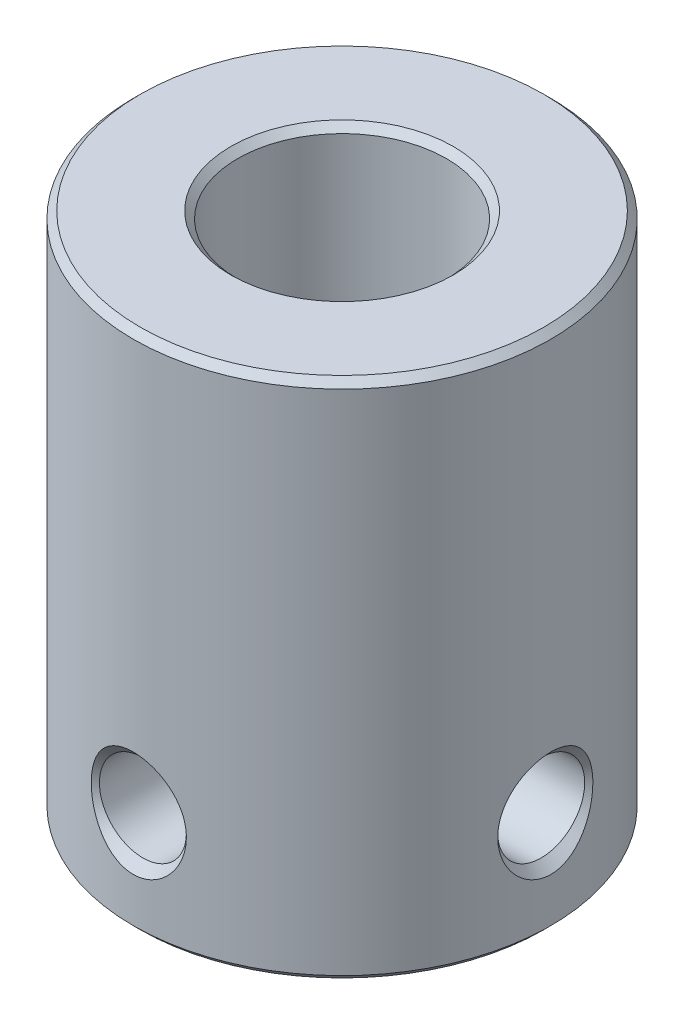
ISO-10303-21;
HEADER;
FILE_DESCRIPTION(('STEP AP214'),'2;1');
FILE_NAME('part.step','',(''),(''),'','','');
FILE_SCHEMA(('AUTOMOTIVE_DESIGN { 1 0 10303 214 1 1 1 1 }'));
ENDSEC;
DATA;
#1=APPLICATION_CONTEXT('core data for automotive mechanical design processes');
#2=APPLICATION_PROTOCOL_DEFINITION('international standard','automotive_design',2000,#1);
#3=PRODUCT_CONTEXT('',#1,'mechanical');
#4=PRODUCT('Part','Part','',(#3));
#5=PRODUCT_RELATED_PRODUCT_CATEGORY('part','',(#4));
#6=PRODUCT_DEFINITION_FORMATION('','',#4);
#7=PRODUCT_DEFINITION_CONTEXT('part definition',#1,'design');
#8=PRODUCT_DEFINITION('design','',#6,#7);
#9=PRODUCT_DEFINITION_SHAPE('','',#8);
#10=(LENGTH_UNIT() NAMED_UNIT(*) SI_UNIT(.MILLI.,.METRE.));
#11=(NAMED_UNIT(*) PLANE_ANGLE_UNIT() SI_UNIT($,.RADIAN.));
#12=(NAMED_UNIT(*) SI_UNIT($,.STERADIAN.) SOLID_ANGLE_UNIT());
#13=UNCERTAINTY_MEASURE_WITH_UNIT(LENGTH_MEASURE(1.E-05),#10,'distance_accuracy_value','');
#14=(GEOMETRIC_REPRESENTATION_CONTEXT(3) GLOBAL_UNCERTAINTY_ASSIGNED_CONTEXT((#13)) GLOBAL_UNIT_ASSIGNED_CONTEXT((#10,
#11,#12)) REPRESENTATION_CONTEXT('',''));
#15=CARTESIAN_POINT('',(0.,0.,0.));
#16=DIRECTION('',(0.,0.,1.));
#17=DIRECTION('',(1.,0.,0.));
#18=AXIS2_PLACEMENT_3D('',#15,#16,#17);
#19=CARTESIAN_POINT('',(0.,7.5,0.));
#20=DIRECTION('',(0.,1.,0.));
#21=DIRECTION('',(0.,0.,1.));
#22=AXIS2_PLACEMENT_3D('',#19,#20,#21);
#23=PLANE('',#22);
#24=CARTESIAN_POINT('',(0.,7.5,0.));
#25=DIRECTION('',(0.,1.,0.));
#26=DIRECTION('',(0.,0.,1.));
#27=AXIS2_PLACEMENT_3D('',#24,#25,#26);
#28=CIRCLE('',#27,3.2);
#29=CARTESIAN_POINT('',(0.,7.5,3.2));
#30=VERTEX_POINT('',#29);
#31=EDGE_CURVE('E39',#30,#30,#28,.F.);
#32=ORIENTED_EDGE('',*,*,#31,.T.);
#33=EDGE_LOOP('',(#32));
#34=FACE_BOUND('',#33,.T.);
#35=CARTESIAN_POINT('',(0.,7.5,0.));
#36=DIRECTION('',(0.,1.,0.));
#37=DIRECTION('',(0.,0.,1.));
#38=AXIS2_PLACEMENT_3D('',#35,#36,#37);
#39=CIRCLE('',#38,5.8);
#40=CARTESIAN_POINT('',(0.,7.5,5.8));
#41=VERTEX_POINT('',#40);
#42=EDGE_CURVE('E61',#41,#41,#39,.T.);
#43=ORIENTED_EDGE('',*,*,#42,.T.);
#44=EDGE_LOOP('',(#43));
#45=FACE_BOUND('',#44,.T.);
#46=ADVANCED_FACE('F32',(#34,#45),#23,.T.);
#47=CARTESIAN_POINT('',(0.,-7.5,0.));
#48=DIRECTION('',(0.,1.,0.));
#49=DIRECTION('',(0.,0.,1.));
#50=AXIS2_PLACEMENT_3D('',#47,#48,#49);
#51=PLANE('',#50);
#52=CARTESIAN_POINT('',(0.,-7.5,0.));
#53=DIRECTION('',(0.,1.,0.));
#54=DIRECTION('',(0.,0.,1.));
#55=AXIS2_PLACEMENT_3D('',#52,#53,#54);
#56=CIRCLE('',#55,3.2);
#57=CARTESIAN_POINT('',(0.,-7.5,3.2));
#58=VERTEX_POINT('',#57);
#59=EDGE_CURVE('E10',#58,#58,#56,.T.);
#60=ORIENTED_EDGE('',*,*,#59,.T.);
#61=EDGE_LOOP('',(#60));
#62=FACE_BOUND('',#61,.T.);
#63=CARTESIAN_POINT('',(0.,-7.5,0.));
#64=DIRECTION('',(0.,1.,0.));
#65=DIRECTION('',(0.,0.,1.));
#66=AXIS2_PLACEMENT_3D('',#63,#64,#65);
#67=CIRCLE('',#66,5.8);
#68=CARTESIAN_POINT('',(0.,-7.5,5.8));
#69=VERTEX_POINT('',#68);
#70=EDGE_CURVE('E52',#69,#69,#67,.F.);
#71=ORIENTED_EDGE('',*,*,#70,.T.);
#72=EDGE_LOOP('',(#71));
#73=FACE_BOUND('',#72,.T.);
#74=ADVANCED_FACE('F130',(#62,#73),#51,.F.);
#75=CARTESIAN_POINT('',(0.,7.5,0.));
#76=DIRECTION('',(0.,-1.,0.));
#77=DIRECTION('',(0.,0.,-1.));
#78=AXIS2_PLACEMENT_3D('',#75,#76,#77);
#79=CYLINDRICAL_SURFACE('',#78,6.);
#80=CARTESIAN_POINT('',(0.,7.3,0.));
#81=DIRECTION('',(0.,1.,0.));
#82=DIRECTION('',(0.,0.,1.));
#83=AXIS2_PLACEMENT_3D('',#80,#81,#82);
#84=CIRCLE('',#83,6.);
#85=CARTESIAN_POINT('',(0.,7.3,6.));
#86=VERTEX_POINT('',#85);
#87=EDGE_CURVE('E55',#86,#86,#84,.F.);
#88=ORIENTED_EDGE('',*,*,#87,.T.);
#89=EDGE_LOOP('',(#88));
#90=FACE_BOUND('',#89,.T.);
#91=CARTESIAN_POINT('',(0.,-7.3,0.));
#92=DIRECTION('',(0.,1.,0.));
#93=DIRECTION('',(0.,0.,1.));
#94=AXIS2_PLACEMENT_3D('',#91,#92,#93);
#95=CIRCLE('',#94,6.);
#96=CARTESIAN_POINT('',(0.,-7.3,6.));
#97=VERTEX_POINT('',#96);
#98=EDGE_CURVE('E58',#97,#97,#95,.T.);
#99=ORIENTED_EDGE('',*,*,#98,.T.);
#100=EDGE_LOOP('',(#99));
#101=FACE_BOUND('',#100,.T.);
#102=CARTESIAN_POINT('',(5.91483775658698,-5.52880434718538,-1.00732038769464));
#103=CARTESIAN_POINT('',(5.92250143302276,-5.58359558251655,-0.96231719133285));
#104=CARTESIAN_POINT('',(5.93030364918487,-5.63514907366489,-0.913408766582243));
#105=CARTESIAN_POINT('',(5.94553080189818,-5.73042720717013,-0.808379865747829));
#106=CARTESIAN_POINT('',(5.95295567860448,-5.77415061045651,-0.752258250623685));
#107=CARTESIAN_POINT('',(5.96766017069519,-5.85751577321552,-0.625775906560477));
#108=CARTESIAN_POINT('',(5.97478837095161,-5.89583564457271,-0.554514363546628));
#109=CARTESIAN_POINT('',(5.98671934201503,-5.95843229055529,-0.405867471684212));
#110=CARTESIAN_POINT('',(5.99152330296312,-5.98271625359679,-0.328485280620282));
#111=CARTESIAN_POINT('',(5.99774309929264,-6.01389061790406,-0.179022980119083));
#112=CARTESIAN_POINT('',(5.99947254754072,-6.02239554861059,-0.107291191193534));
#113=CARTESIAN_POINT('',(6.00031889859756,-6.02657519783022,0.0365433461045991));
#114=CARTESIAN_POINT('',(5.99943704967178,-6.0222560465731,0.108645900791913));
#115=CARTESIAN_POINT('',(5.9953141428284,-6.00174251937129,0.246267331412398));
#116=CARTESIAN_POINT('',(5.99222926587409,-5.98633378990009,0.311910511379788));
#117=CARTESIAN_POINT('',(5.98420472660848,-5.94526541286433,0.439773481718744));
#118=CARTESIAN_POINT('',(5.97926484940367,-5.91960457761698,0.501992874501983));
#119=CARTESIAN_POINT('',(5.96780788972078,-5.85798302314558,0.623821573841086));
#120=CARTESIAN_POINT('',(5.96123965290115,-5.82167938446308,0.683251734031637));
#121=CARTESIAN_POINT('',(5.94725631626724,-5.74054126278918,0.795843853683658));
#122=CARTESIAN_POINT('',(5.93984090319929,-5.69570362013862,0.849003479675818));
#123=CARTESIAN_POINT('',(5.92402343783295,-5.59381714213767,0.953425641188953));
#124=CARTESIAN_POINT('',(5.91559884905014,-5.53598399195474,1.0039189675661));
#125=CARTESIAN_POINT('',(5.89930740201001,-5.41329729865581,1.09560247377607));
#126=CARTESIAN_POINT('',(5.89144079995428,-5.34844056472943,1.13678839881262));
#127=CARTESIAN_POINT('',(5.87619471710081,-5.20602554544595,1.21326939045289));
#128=CARTESIAN_POINT('',(5.86895929187496,-5.12785179755007,1.24744994572646));
#129=CARTESIAN_POINT('',(5.85681342349581,-4.96698149587859,1.30328607153369));
#130=CARTESIAN_POINT('',(5.85190368791816,-4.88428357417848,1.32493783070759));
#131=CARTESIAN_POINT('',(5.84470479401133,-4.71114418639205,1.35635884916716));
#132=CARTESIAN_POINT('',(5.84259984288051,-4.62054279552529,1.36529527069334));
#133=CARTESIAN_POINT('',(5.84184891201592,-4.43906164612307,1.36850379007076));
#134=CARTESIAN_POINT('',(5.84320343033836,-4.34818184938716,1.36277377641035));
#135=CARTESIAN_POINT('',(5.84926447121163,-4.167114005683,1.33652139344611));
#136=CARTESIAN_POINT('',(5.85402734914448,-4.07696371182694,1.31575025758392));
#137=CARTESIAN_POINT('',(5.86639064678413,-3.90155996932685,1.25947827652881));
#138=CARTESIAN_POINT('',(5.87399147604598,-3.81630722951656,1.22397530524896));
#139=CARTESIAN_POINT('',(5.89099266428588,-3.65431766227651,1.13931658553145));
#140=CARTESIAN_POINT('',(5.90037103529285,-3.57749322211883,1.09032465076896));
#141=CARTESIAN_POINT('',(5.91980290525049,-3.43393683171995,0.979334263350389));
#142=CARTESIAN_POINT('',(5.92985625339069,-3.36720263777469,0.917338709567679));
#143=CARTESIAN_POINT('',(5.94866235503463,-3.25047970796999,0.785839093358964));
#144=CARTESIAN_POINT('',(5.95745709429637,-3.19971020945739,0.717037204024117));
#145=CARTESIAN_POINT('',(5.97323304290606,-3.11218993947923,0.570842030480323));
#146=CARTESIAN_POINT('',(5.98021625620802,-3.07542365604582,0.493458376126511));
#147=CARTESIAN_POINT('',(5.99065652467354,-3.02156453936078,0.342181655398979));
#148=CARTESIAN_POINT('',(5.99443248305544,-3.00266187515818,0.268954589457799));
#149=CARTESIAN_POINT('',(5.99925587966176,-2.97862989467197,0.120197675343194));
#150=CARTESIAN_POINT('',(6.0003052608659,-2.97349077030445,0.0446695058064256));
#151=CARTESIAN_POINT('',(5.99957496988739,-2.97710002520825,-0.0987424051799276));
#152=CARTESIAN_POINT('',(5.9980572860741,-2.98456222093989,-0.166663760494614));
#153=CARTESIAN_POINT('',(5.99285568280296,-3.01058412024266,-0.300247551750553));
#154=CARTESIAN_POINT('',(5.98917182574296,-3.02914350415323,-0.365910052701725));
#155=CARTESIAN_POINT('',(5.98002734531731,-3.07650122650132,-0.493317050061272));
#156=CARTESIAN_POINT('',(5.974565603009,-3.10530601412067,-0.555059049712904));
#157=CARTESIAN_POINT('',(5.96240111334889,-3.17198493978084,-0.673283580356394));
#158=CARTESIAN_POINT('',(5.95569801010474,-3.2098616796235,-0.729764596051797));
#159=CARTESIAN_POINT('',(5.94103703297596,-3.29703511182797,-0.841132455502549));
#160=CARTESIAN_POINT('',(5.93302078003899,-3.34703600676436,-0.895459311913344));
#161=CARTESIAN_POINT('',(5.91698216428724,-3.45464944395809,-0.995950274759308));
#162=CARTESIAN_POINT('',(5.90895980035552,-3.51226546103483,-1.0421106321565));
#163=CARTESIAN_POINT('',(5.89273640259105,-3.64050732728281,-1.13044343631093));
#164=CARTESIAN_POINT('',(5.88461868247891,-3.7118675568078,-1.17156643394772));
#165=CARTESIAN_POINT('',(5.87007047103072,-3.86019744984599,-1.24241014142088));
#166=CARTESIAN_POINT('',(5.86364060626173,-3.93716918295645,-1.27212661880632));
#167=CARTESIAN_POINT('',(5.85267221327211,-4.10131546169884,-1.32171593410431));
#168=CARTESIAN_POINT('',(5.84833204593824,-4.18880904970982,-1.34058159574163));
#169=CARTESIAN_POINT('',(5.84286977192732,-4.36578400660721,-1.36419197372845));
#170=CARTESIAN_POINT('',(5.84174832468513,-4.455265779039,-1.36893379646578));
#171=CARTESIAN_POINT('',(5.8428695828304,-4.63659285361932,-1.36414222217699));
#172=CARTESIAN_POINT('',(5.84521689344821,-4.72842613479394,-1.35416496629165));
#173=CARTESIAN_POINT('',(5.85318843834412,-4.90908399926716,-1.31928088071326));
#174=CARTESIAN_POINT('',(5.85881292892226,-4.99790834666961,-1.29437288331995));
#175=CARTESIAN_POINT('',(5.87221550271232,-5.16449188907803,-1.23208258805451));
#176=CARTESIAN_POINT('',(5.87983549061587,-5.24259564052972,-1.19558555115354));
#177=CARTESIAN_POINT('',(5.89651629692057,-5.39163991471806,-1.1103933282274));
#178=CARTESIAN_POINT('',(5.90557585236715,-5.46258662805586,-1.06170881311713));
#179=CARTESIAN_POINT('',(5.91483775658698,-5.52880434718538,-1.00732038769464));
#180=B_SPLINE_CURVE_WITH_KNOTS('',3,(#102,#103,#104,#105,#106,#107,#108,#109,#110,#111,#112,
#113,#114,#115,#116,#117,#118,#119,#120,#121,#122,#123,#124,#125,#126,#127,#128,#129,#130,#131,
#132,#133,#134,#135,#136,#137,#138,#139,#140,#141,#142,#143,#144,#145,#146,#147,#148,#149,#150,
#151,#152,#153,#154,#155,#156,#157,#158,#159,#160,#161,#162,#163,#164,#165,#166,#167,#168,#169,
#170,#171,#172,#173,#174,#175,#176,#177,#178,#179),.UNSPECIFIED.,.T.,.F.,(4,2,2,2,2,2,2,2,2,2,2,
2,2,2,2,2,2,2,2,2,2,2,2,2,2,2,2,2,2,2,2,2,2,2,2,2,2,2,4),(0.,0.213733155541429,
0.427500103408986,0.669774253726973,0.911924214426111,1.12753658726001,1.34304590861946,
1.54462496549482,1.74622738161344,1.95521605804028,2.16428226220785,2.39504187409212,
2.62590676325623,2.88167235444699,3.13751571072332,3.40944750266354,3.68141844654747,
3.95799338049485,4.2346082434101,4.50800168423482,4.78133424260522,5.03775015078952,
5.29388118407226,5.51978182408476,5.74552144137092,5.94958401217287,6.15364070512412,
6.35782607377605,6.56207007229319,6.78397194471273,7.00597542394403,7.25320961412632,
7.50053545341273,7.76814510772494,8.03580958461881,8.3117123175442,8.58763663102754,
8.84616851973653,9.10447483418194),.UNSPECIFIED.);
#181=CARTESIAN_POINT('',(5.91483775658698,-5.52880434718538,-1.00732038769464));
#182=VERTEX_POINT('',#181);
#183=EDGE_CURVE('E64',#182,#182,#180,.T.);
#184=ORIENTED_EDGE('',*,*,#183,.T.);
#185=EDGE_LOOP('',(#184));
#186=FACE_BOUND('',#185,.T.);
#187=CARTESIAN_POINT('',(-1.00732038769462,-5.52880434718538,5.91483775658699));
#188=CARTESIAN_POINT('',(-1.0625572167337,-5.46155091999607,5.90543128244687));
#189=CARTESIAN_POINT('',(-1.1119450928033,-5.38937330269842,5.89622727626031));
#190=CARTESIAN_POINT('',(-1.19816011091402,-5.23762009401937,5.87931576917396));
#191=CARTESIAN_POINT('',(-1.23496409543614,-5.15803120271254,5.87161103842038));
#192=CARTESIAN_POINT('',(-1.29550008714942,-4.99351722786288,5.85855311445987));
#193=CARTESIAN_POINT('',(-1.31918435597302,-4.908573893283,5.8532085231466));
#194=CARTESIAN_POINT('',(-1.35290234778387,-4.73593483174043,5.84550733148309));
#195=CARTESIAN_POINT('',(-1.36294121055757,-4.64824015386151,5.8431496060991));
#196=CARTESIAN_POINT('',(-1.3693652007367,-4.46853001119642,5.84164829843658));
#197=CARTESIAN_POINT('',(-1.36514396828115,-4.37649105273633,5.84264744553621));
#198=CARTESIAN_POINT('',(-1.34176422645992,-4.19440863279622,5.84806031937853));
#199=CARTESIAN_POINT('',(-1.32260179220375,-4.10436570204361,5.85247494332733));
#200=CARTESIAN_POINT('',(-1.26955658372633,-3.92854446132797,5.86421037888129));
#201=CARTESIAN_POINT('',(-1.23561954165774,-3.84278318511065,5.87154189574134));
#202=CARTESIAN_POINT('',(-1.15355452356077,-3.67851037144327,5.88821351349966));
#203=CARTESIAN_POINT('',(-1.10542559254557,-3.59999932233548,5.89755374955527));
#204=CARTESIAN_POINT('',(-0.997431067079705,-3.45518930712506,5.91675947634123));
#205=CARTESIAN_POINT('',(-0.937956064421904,-3.38859712422252,5.92660116071936));
#206=CARTESIAN_POINT('',(-0.8075727785725,-3.26760988936145,5.9457671407107));
#207=CARTESIAN_POINT('',(-0.736672119814303,-3.213206761018,5.9550917758162));
#208=CARTESIAN_POINT('',(-0.592229184508392,-3.12374817682862,5.97110086326186));
#209=CARTESIAN_POINT('',(-0.519522334296951,-3.08737781321554,5.97794883133935));
#210=CARTESIAN_POINT('',(-0.368354061775824,-3.02911448741262,5.98915923947937));
#211=CARTESIAN_POINT('',(-0.289899115696944,-3.00720550237337,5.99352442965381));
#212=CARTESIAN_POINT('',(-0.13979016106698,-2.98096768330364,5.99878383296519));
#213=CARTESIAN_POINT('',(-0.0684608162744463,-2.97483351117073,6.00003390907518));
#214=CARTESIAN_POINT('',(0.0741565668801916,-2.97517315802589,5.99996473941875));
#215=CARTESIAN_POINT('',(0.145444611044835,-2.98164269809429,5.99864636563278));
#216=CARTESIAN_POINT('',(0.281699711330631,-3.00609283682453,5.99374965828111));
#217=CARTESIAN_POINT('',(0.346795376060322,-3.0233957922328,5.99030452290537));
#218=CARTESIAN_POINT('',(0.473295716776517,-3.0680653954857,5.98163978874799));
#219=CARTESIAN_POINT('',(0.534699911497292,-3.09543335223238,5.97641995918308));
#220=CARTESIAN_POINT('',(0.65514893789217,-3.16056506272911,5.96444546834219));
#221=CARTESIAN_POINT('',(0.713964814463625,-3.1987396347208,5.95763252098112));
#222=CARTESIAN_POINT('',(0.82507501536845,-3.28349324999904,5.94326477324329));
#223=CARTESIAN_POINT('',(0.877366791748901,-3.33007555961427,5.93570968507338));
#224=CARTESIAN_POINT('',(0.979878874616083,-3.43562797531465,5.91969696852427));
#225=CARTESIAN_POINT('',(1.02928222856886,-3.49538963393331,5.91122908464167));
#226=CARTESIAN_POINT('',(1.11849706997978,-3.62176985100494,5.89499995296438));
#227=CARTESIAN_POINT('',(1.15830421538347,-3.68839149405212,5.88723902603517));
#228=CARTESIAN_POINT('',(1.23150221770142,-3.83414545659208,5.87238854278172));
#229=CARTESIAN_POINT('',(1.26377583596079,-3.91385642111225,5.86545576964514));
#230=CARTESIAN_POINT('',(1.31553900889379,-4.07749466440027,5.85406362893617));
#231=CARTESIAN_POINT('',(1.33502492532302,-4.16142313579053,5.84960496533133));
#232=CARTESIAN_POINT('',(1.36167438773833,-4.3363287095171,5.84346196331302));
#233=CARTESIAN_POINT('',(1.36805648423666,-4.42743207515459,5.84195380587374));
#234=CARTESIAN_POINT('',(1.36606722652635,-4.60947458279687,5.84241898623785));
#235=CARTESIAN_POINT('',(1.35769381176682,-4.70041370008975,5.84439281028674));
#236=CARTESIAN_POINT('',(1.3261106711044,-4.88087251754856,5.8516404284706));
#237=CARTESIAN_POINT('',(1.30269440448541,-4.97035439309859,5.85696014054536));
#238=CARTESIAN_POINT('',(1.24121316011803,-5.14395500428369,5.87029590269997));
#239=CARTESIAN_POINT('',(1.20314612768998,-5.22807298573593,5.87831233095778));
#240=CARTESIAN_POINT('',(1.1136494956924,-5.38708237219113,5.895916249366));
#241=CARTESIAN_POINT('',(1.06242403970803,-5.46209099188998,5.90547897651683));
#242=CARTESIAN_POINT('',(0.94722814343741,-5.60157482906759,5.92504502332219));
#243=CARTESIAN_POINT('',(0.883261528037212,-5.66605319717313,5.93504821005079));
#244=CARTESIAN_POINT('',(0.748703574776038,-5.77762814169033,5.95346362496181));
#245=CARTESIAN_POINT('',(0.678855355228888,-5.82560676043869,5.96193773582487));
#246=CARTESIAN_POINT('',(0.531105524715199,-5.90737381699441,5.9769062092819));
#247=CARTESIAN_POINT('',(0.453213174667967,-5.94117835087217,5.98340281521654));
#248=CARTESIAN_POINT('',(0.301742486861647,-5.98938877554947,5.99282925286203));
#249=CARTESIAN_POINT('',(0.228770506103551,-6.00563759021851,5.99609387934914));
#250=CARTESIAN_POINT('',(0.0810310347313774,-6.02456715573357,5.99990641356615));
#251=CARTESIAN_POINT('',(0.00626477786796726,-6.02725697559177,6.00045613716958));
#252=CARTESIAN_POINT('',(-0.135775253712959,-6.01930139765877,5.99884670170859));
#253=CARTESIAN_POINT('',(-0.203121027444959,-6.00982726074938,5.99692544307746));
#254=CARTESIAN_POINT('',(-0.335264748290144,-5.98000168075585,5.99099100463259));
#255=CARTESIAN_POINT('',(-0.400062186390657,-5.95964807630015,5.98697740914826));
#256=CARTESIAN_POINT('',(-0.526115404644998,-5.90873578458455,5.97722735475829));
#257=CARTESIAN_POINT('',(-0.58732833618892,-5.87807515895454,5.97147374623539));
#258=CARTESIAN_POINT('',(-0.704205646800115,-5.80783224011122,5.95882130341706));
#259=CARTESIAN_POINT('',(-0.759873062239022,-5.76825486829321,5.95192310140536));
#260=CARTESIAN_POINT('',(-0.847902845940638,-5.69544593662472,5.93989518893234));
#261=CARTESIAN_POINT('',(-0.882006576514371,-5.66426087416513,5.93490934552203));
#262=CARTESIAN_POINT('',(-0.94706242091887,-5.59878064313327,5.92487592256493));
#263=CARTESIAN_POINT('',(-0.978014589884656,-5.56448552898969,5.91982834409989));
#264=CARTESIAN_POINT('',(-1.00732038769462,-5.52880434718538,5.91483775658699));
#265=B_SPLINE_CURVE_WITH_KNOTS('',3,(#187,#188,#189,#190,#191,#192,#193,#194,#195,#196,#197,
#198,#199,#200,#201,#202,#203,#204,#205,#206,#207,#208,#209,#210,#211,#212,#213,#214,#215,#216,
#217,#218,#219,#220,#221,#222,#223,#224,#225,#226,#227,#228,#229,#230,#231,#232,#233,#234,#235,
#236,#237,#238,#239,#240,#241,#242,#243,#244,#245,#246,#247,#248,#249,#250,#251,#252,#253,#254,
#255,#256,#257,#258,#259,#260,#261,#262,#263,#264),.UNSPECIFIED.,.T.,.F.,(4,2,2,2,2,2,2,2,2,2,2,
2,2,2,2,2,2,2,2,2,2,2,2,2,2,2,2,2,2,2,2,2,2,2,2,2,2,2,4),(0.,0.262436347529811,
0.525353076759219,0.789220293463886,1.05298809229006,1.32811039544879,1.6033049945899,
1.87951903929044,2.15575167496151,2.42378855151126,2.69164729993872,2.93499491007315,
3.17807244246412,3.39175918356619,3.60537339135056,3.80680298500645,4.00825878282087,
4.21874018382817,4.42930353161712,4.66234338592004,4.89548848808495,5.15318720780322,
5.41095921394385,5.68370323030381,5.95648533734415,6.233095240581,6.50974395079713,
6.78233570784823,7.05484575606622,7.30888108663873,7.56262714858272,7.78588157210961,
8.00898665079045,8.21213588750413,8.41532549790893,8.62058689753883,8.82573528413765,
8.96497284079323,9.10420796113757),.UNSPECIFIED.);
#266=CARTESIAN_POINT('',(-1.00732038769462,-5.52880434718538,5.91483775658699));
#267=VERTEX_POINT('',#266);
#268=EDGE_CURVE('E72',#267,#267,#265,.T.);
#269=ORIENTED_EDGE('',*,*,#268,.T.);
#270=EDGE_LOOP('',(#269));
#271=FACE_BOUND('',#270,.T.);
#272=ADVANCED_FACE('F78',(#90,#101,#186,#271),#79,.T.);
#273=CARTESIAN_POINT('',(0.,7.5,0.));
#274=DIRECTION('',(0.,-1.,0.));
#275=DIRECTION('',(0.,0.,-1.));
#276=AXIS2_PLACEMENT_3D('',#273,#274,#275);
#277=CYLINDRICAL_SURFACE('',#276,3.);
#278=CARTESIAN_POINT('',(0.,7.3,0.));
#279=DIRECTION('',(0.,1.,0.));
#280=DIRECTION('',(0.,0.,1.));
#281=AXIS2_PLACEMENT_3D('',#278,#279,#280);
#282=CIRCLE('',#281,3.);
#283=CARTESIAN_POINT('',(0.,7.3,3.));
#284=VERTEX_POINT('',#283);
#285=EDGE_CURVE('E43',#284,#284,#282,.T.);
#286=ORIENTED_EDGE('',*,*,#285,.T.);
#287=EDGE_LOOP('',(#286));
#288=FACE_BOUND('',#287,.T.);
#289=CARTESIAN_POINT('',(0.,-7.3,0.));
#290=DIRECTION('',(0.,1.,0.));
#291=DIRECTION('',(0.,0.,1.));
#292=AXIS2_PLACEMENT_3D('',#289,#290,#291);
#293=CIRCLE('',#292,3.);
#294=CARTESIAN_POINT('',(0.,-7.3,3.));
#295=VERTEX_POINT('',#294);
#296=EDGE_CURVE('E47',#295,#295,#293,.F.);
#297=ORIENTED_EDGE('',*,*,#296,.T.);
#298=EDGE_LOOP('',(#297));
#299=FACE_BOUND('',#298,.T.);
#300=CARTESIAN_POINT('',(2.72717802865893,-4.5,-1.25000000000001));
#301=CARTESIAN_POINT('',(2.72718519563219,-4.56667189089685,-1.24999259066568));
#302=CARTESIAN_POINT('',(2.729658595344,-4.63345265682621,-1.24463203881504));
#303=CARTESIAN_POINT('',(2.73923833650884,-4.76508694205714,-1.22339678947785));
#304=CARTESIAN_POINT('',(2.74635725824266,-4.82993472667524,-1.20749354003277));
#305=CARTESIAN_POINT('',(2.76426917574767,-4.95556112969107,-1.16589988419452));
#306=CARTESIAN_POINT('',(2.77504717562615,-5.01635516371502,-1.14024937431429));
#307=CARTESIAN_POINT('',(2.79904148565793,-5.13275944957805,-1.08000637754464));
#308=CARTESIAN_POINT('',(2.81225721880783,-5.18837092343312,-1.04541600591532));
#309=CARTESIAN_POINT('',(2.84055762619856,-5.29632572497347,-0.965973882676176));
#310=CARTESIAN_POINT('',(2.85570568079145,-5.34830755874409,-0.920653238184418));
#311=CARTESIAN_POINT('',(2.88564295372226,-5.44420022249755,-0.82202167574556));
#312=CARTESIAN_POINT('',(2.90043203180789,-5.48810794061301,-0.768707691374015));
#313=CARTESIAN_POINT('',(2.92875537930613,-5.56844953087928,-0.652763393797359));
#314=CARTESIAN_POINT('',(2.94220739975291,-5.60447662803235,-0.58982929368367));
#315=CARTESIAN_POINT('',(2.96556519993426,-5.6652760205056,-0.458132022362364));
#316=CARTESIAN_POINT('',(2.97547255347157,-5.69005331196422,-0.389371454872135));
#317=CARTESIAN_POINT('',(2.99017521042367,-5.72633945875674,-0.251768498025176));
#318=CARTESIAN_POINT('',(2.99520971127466,-5.73847169490204,-0.183116576196091));
#319=CARTESIAN_POINT('',(3.00046828611204,-5.75113764115986,-0.0445791803650168));
#320=CARTESIAN_POINT('',(3.00069431131015,-5.75167605588296,0.0253057817645056));
#321=CARTESIAN_POINT('',(2.99645129133057,-5.74146571906668,0.159792780112557));
#322=CARTESIAN_POINT('',(2.99226714648664,-5.73140189947427,0.224457488607303));
#323=CARTESIAN_POINT('',(2.98006516750309,-5.70144689736184,0.351082893931445));
#324=CARTESIAN_POINT('',(2.97204705074577,-5.68155499036983,0.413043391054905));
#325=CARTESIAN_POINT('',(2.95279852414029,-5.63227195910536,0.533638118077515));
#326=CARTESIAN_POINT('',(2.94152097126085,-5.60274053712917,0.592207177074896));
#327=CARTESIAN_POINT('',(2.91685713989805,-5.53515424329966,0.703711767281953));
#328=CARTESIAN_POINT('',(2.90347011666255,-5.49709635915501,0.756645297756964));
#329=CARTESIAN_POINT('',(2.87481698777061,-5.41041757959538,0.859340911707913));
#330=CARTESIAN_POINT('',(2.8594849435601,-5.36124120872099,0.90861643731623));
#331=CARTESIAN_POINT('',(2.82937860681471,-5.25528855929342,0.998431414927657));
#332=CARTESIAN_POINT('',(2.81460453131371,-5.19850936170791,1.0389674958243));
#333=CARTESIAN_POINT('',(2.78681612355339,-5.07660496333809,1.11140189250062));
#334=CARTESIAN_POINT('',(2.77387558556715,-5.01126679425672,1.14297253355539));
#335=CARTESIAN_POINT('',(2.75209844221012,-4.8755189550255,1.1944643205839));
#336=CARTESIAN_POINT('',(2.74325890334595,-4.80511295173045,1.21439379627312));
#337=CARTESIAN_POINT('',(2.73141212519724,-4.666103191086,1.2408002516812));
#338=CARTESIAN_POINT('',(2.72806369197117,-4.59767887774095,1.24806614632865));
#339=CARTESIAN_POINT('',(2.72660286810643,-4.4605215175885,1.25125630518998));
#340=CARTESIAN_POINT('',(2.72848866599319,-4.39178858580829,1.24718449318148));
#341=CARTESIAN_POINT('',(2.7369313134575,-4.26060161456955,1.22853477565555));
#342=CARTESIAN_POINT('',(2.74318138016618,-4.1980273132132,1.21464618818047));
#343=CARTESIAN_POINT('',(2.75925630297447,-4.07614870350213,1.17767058564224));
#344=CARTESIAN_POINT('',(2.76908199460161,-4.01684516316929,1.15458142053124));
#345=CARTESIAN_POINT('',(2.79170797857001,-3.90038468964353,1.09877520805186));
#346=CARTESIAN_POINT('',(2.80461662202283,-3.84342502538968,1.06569183306197));
#347=CARTESIAN_POINT('',(2.83180003740794,-3.73559194750098,0.99120078438596));
#348=CARTESIAN_POINT('',(2.84607539920584,-3.68472118329813,0.949789507875977));
#349=CARTESIAN_POINT('',(2.87578619784533,-3.586199865116,0.855844455715494));
#350=CARTESIAN_POINT('',(2.89122146708842,-3.53914860004934,0.802679661479727));
#351=CARTESIAN_POINT('',(2.92043361183923,-3.45452770802067,0.688851512553528));
#352=CARTESIAN_POINT('',(2.93421036577014,-3.4169587759363,0.628187608803646));
#353=CARTESIAN_POINT('',(2.9586425158565,-3.35241012455643,0.500654680803374));
#354=CARTESIAN_POINT('',(2.96928983138826,-3.32545775871052,0.433770169638496));
#355=CARTESIAN_POINT('',(2.98618173103366,-3.28338320766557,0.295858835154407));
#356=CARTESIAN_POINT('',(2.9924289351992,-3.26825398177393,0.224834504225185));
#357=CARTESIAN_POINT('',(2.9995153479751,-3.25114187447969,0.0860165335064008));
#358=CARTESIAN_POINT('',(3.00070204534225,-3.24831400030304,0.0183440847938877));
#359=CARTESIAN_POINT('',(2.99849523480953,-3.25361314129394,-0.116486811714295));
#360=CARTESIAN_POINT('',(2.99510252984313,-3.26173823601287,-0.183645347541165));
#361=CARTESIAN_POINT('',(2.98430065981734,-3.28810607215866,-0.313086482449195));
#362=CARTESIAN_POINT('',(2.97703824209233,-3.30597968046955,-0.375457537843579));
#363=CARTESIAN_POINT('',(2.95929499847058,-3.35093424720913,-0.49629223050134));
#364=CARTESIAN_POINT('',(2.94881356124206,-3.37801695466491,-0.554755122985836));
#365=CARTESIAN_POINT('',(2.92505825398662,-3.44198952921446,-0.669024565478791));
#366=CARTESIAN_POINT('',(2.91167959188765,-3.47926730142399,-0.724591657976692));
#367=CARTESIAN_POINT('',(2.8837156187423,-3.56200718287189,-0.828918675638791));
#368=CARTESIAN_POINT('',(2.86912986083797,-3.60747233040675,-0.877676061786052));
#369=CARTESIAN_POINT('',(2.8391484525914,-3.7089448258544,-0.97044978723159));
#370=CARTESIAN_POINT('',(2.82376522857896,-3.76545901462112,-1.01391775364848));
#371=CARTESIAN_POINT('',(2.79495552690185,-3.88545874068019,-1.09083332306675));
#372=CARTESIAN_POINT('',(2.78153014522558,-3.94894814805814,-1.12427532456756));
#373=CARTESIAN_POINT('',(2.75842557732642,-4.08094383502275,-1.17982766043578));
#374=CARTESIAN_POINT('',(2.74872654469865,-4.14942115879321,-1.20199823632855));
#375=CARTESIAN_POINT('',(2.73440803066667,-4.28953957385067,-1.23423556453802));
#376=CARTESIAN_POINT('',(2.7297715160498,-4.3611692072743,-1.24434291521211));
#377=CARTESIAN_POINT('',(2.72744979732687,-4.45535852426189,-1.2494046492365));
#378=CARTESIAN_POINT('',(2.72717562860874,-4.47767315738804,-1.25000248121119));
#379=CARTESIAN_POINT('',(2.72717802865893,-4.5,-1.25000000000001));
#380=B_SPLINE_CURVE_WITH_KNOTS('',3,(#300,#301,#302,#303,#304,#305,#306,#307,#308,#309,#310,
#311,#312,#313,#314,#315,#316,#317,#318,#319,#320,#321,#322,#323,#324,#325,#326,#327,#328,#329,
#330,#331,#332,#333,#334,#335,#336,#337,#338,#339,#340,#341,#342,#343,#344,#345,#346,#347,#348,
#349,#350,#351,#352,#353,#354,#355,#356,#357,#358,#359,#360,#361,#362,#363,#364,#365,#366,#367,
#368,#369,#370,#371,#372,#373,#374,#375,#376,#377,#378,#379),.UNSPECIFIED.,.T.,.F.,(4,2,2,2,2,2,
2,2,2,2,2,2,2,2,2,2,2,2,2,2,2,2,2,2,2,2,2,2,2,2,2,2,2,2,2,2,2,2,2,4),(0.,0.199951711985514,
0.400447161842175,0.600130652152111,0.799766938550099,1.01066841430654,1.2216510045991,
1.44178476577924,1.66182066774891,1.87040605977952,2.0789068091793,2.27471840245093,
2.47054443201883,2.66935814640065,2.86824221022484,3.08114531844484,3.29413040441366,
3.51411545666722,3.73394290745569,3.93950778306307,4.14500152518448,4.33733901066192,
4.52972146913529,4.73025126818169,4.93086800795465,5.14781662735513,5.36478114041866,
5.58230105955595,5.79969134643007,6.00188635094053,6.20404590801914,6.39903415036487,
6.59405944632173,6.79789862829037,7.00181361048904,7.21960426908077,7.43751638139189,
7.65425125796865,7.87025464546163,7.93721375436705),.UNSPECIFIED.);
#381=CARTESIAN_POINT('',(2.72717802865893,-4.5,-1.25000000000001));
#382=VERTEX_POINT('',#381);
#383=EDGE_CURVE('E96',#382,#382,#380,.T.);
#384=ORIENTED_EDGE('',*,*,#383,.F.);
#385=EDGE_LOOP('',(#384));
#386=FACE_BOUND('',#385,.T.);
#387=CARTESIAN_POINT('',(1.25,-4.5,2.72717802865893));
#388=CARTESIAN_POINT('',(1.24999259066567,-4.56667189089685,2.72718519563219));
#389=CARTESIAN_POINT('',(1.24463203881503,-4.63345265682621,2.729658595344));
#390=CARTESIAN_POINT('',(1.22339678947784,-4.76508694205714,2.73923833650884));
#391=CARTESIAN_POINT('',(1.20749354003276,-4.82993472667524,2.74635725824267));
#392=CARTESIAN_POINT('',(1.16589988419451,-4.95556112969107,2.76426917574768));
#393=CARTESIAN_POINT('',(1.14024937431428,-5.01635516371501,2.77504717562616));
#394=CARTESIAN_POINT('',(1.08000637754463,-5.13275944957805,2.79904148565793));
#395=CARTESIAN_POINT('',(1.04541600591531,-5.18837092343312,2.81225721880783));
#396=CARTESIAN_POINT('',(0.965973882676165,-5.29632572497347,2.84055762619857));
#397=CARTESIAN_POINT('',(0.920653238184408,-5.34830755874409,2.85570568079146));
#398=CARTESIAN_POINT('',(0.822021675745549,-5.44420022249755,2.88564295372227));
#399=CARTESIAN_POINT('',(0.768707691374004,-5.48810794061301,2.90043203180789));
#400=CARTESIAN_POINT('',(0.652763393797348,-5.56844953087928,2.92875537930613));
#401=CARTESIAN_POINT('',(0.589829293683658,-5.60447662803235,2.94220739975291));
#402=CARTESIAN_POINT('',(0.458132022362352,-5.6652760205056,2.96556519993426));
#403=CARTESIAN_POINT('',(0.389371454872123,-5.69005331196422,2.97547255347157));
#404=CARTESIAN_POINT('',(0.251768498025165,-5.72633945875674,2.99017521042367));
#405=CARTESIAN_POINT('',(0.18311657619608,-5.73847169490204,2.99520971127466));
#406=CARTESIAN_POINT('',(0.0445791803650062,-5.75113764115986,3.00046828611204));
#407=CARTESIAN_POINT('',(-0.0253057817645162,-5.75167605588296,3.00069431131015));
#408=CARTESIAN_POINT('',(-0.159792780112568,-5.74146571906668,2.99645129133057));
#409=CARTESIAN_POINT('',(-0.224457488607314,-5.73140189947427,2.99226714648664));
#410=CARTESIAN_POINT('',(-0.351082893931456,-5.70144689736184,2.98006516750309));
#411=CARTESIAN_POINT('',(-0.413043391054916,-5.68155499036983,2.97204705074577));
#412=CARTESIAN_POINT('',(-0.533638118077525,-5.63227195910536,2.95279852414029));
#413=CARTESIAN_POINT('',(-0.592207177074906,-5.60274053712917,2.94152097126085));
#414=CARTESIAN_POINT('',(-0.703711767281963,-5.53515424329966,2.91685713989805));
#415=CARTESIAN_POINT('',(-0.756645297756974,-5.49709635915501,2.90347011666255));
#416=CARTESIAN_POINT('',(-0.859340911707923,-5.41041757959538,2.87481698777061));
#417=CARTESIAN_POINT('',(-0.908616437316239,-5.36124120872099,2.8594849435601));
#418=CARTESIAN_POINT('',(-0.998431414927667,-5.25528855929342,2.8293786068147));
#419=CARTESIAN_POINT('',(-1.03896749582431,-5.19850936170791,2.8146045313137));
#420=CARTESIAN_POINT('',(-1.11140189250063,-5.07660496333809,2.78681612355338));
#421=CARTESIAN_POINT('',(-1.1429725335554,-5.01126679425672,2.77387558556714));
#422=CARTESIAN_POINT('',(-1.19446432058391,-4.8755189550255,2.75209844221011));
#423=CARTESIAN_POINT('',(-1.21439379627313,-4.80511295173045,2.74325890334594));
#424=CARTESIAN_POINT('',(-1.24080025168121,-4.666103191086,2.73141212519724));
#425=CARTESIAN_POINT('',(-1.24806614632866,-4.59767887774095,2.72806369197117));
#426=CARTESIAN_POINT('',(-1.25125630518998,-4.4605215175885,2.72660286810642));
#427=CARTESIAN_POINT('',(-1.24718449318149,-4.39178858580829,2.72848866599319));
#428=CARTESIAN_POINT('',(-1.22853477565556,-4.26060161456955,2.73693131345749));
#429=CARTESIAN_POINT('',(-1.21464618818048,-4.1980273132132,2.74318138016618));
#430=CARTESIAN_POINT('',(-1.17767058564225,-4.07614870350213,2.75925630297447));
#431=CARTESIAN_POINT('',(-1.15458142053125,-4.01684516316929,2.76908199460161));
#432=CARTESIAN_POINT('',(-1.09877520805186,-3.90038468964353,2.79170797857));
#433=CARTESIAN_POINT('',(-1.06569183306198,-3.84342502538968,2.80461662202282));
#434=CARTESIAN_POINT('',(-0.991200784385969,-3.73559194750098,2.83180003740794));
#435=CARTESIAN_POINT('',(-0.949789507875986,-3.68472118329813,2.84607539920583));
#436=CARTESIAN_POINT('',(-0.855844455715503,-3.58619986511599,2.87578619784532));
#437=CARTESIAN_POINT('',(-0.802679661479737,-3.53914860004934,2.89122146708842));
#438=CARTESIAN_POINT('',(-0.688851512553538,-3.45452770802067,2.92043361183923));
#439=CARTESIAN_POINT('',(-0.628187608803655,-3.4169587759363,2.93421036577014));
#440=CARTESIAN_POINT('',(-0.500654680803383,-3.35241012455643,2.9586425158565));
#441=CARTESIAN_POINT('',(-0.433770169638505,-3.32545775871052,2.96928983138826));
#442=CARTESIAN_POINT('',(-0.295858835154416,-3.28338320766557,2.98618173103366));
#443=CARTESIAN_POINT('',(-0.224834504225194,-3.26825398177393,2.9924289351992));
#444=CARTESIAN_POINT('',(-0.0860165335064107,-3.25114187447969,2.9995153479751));
#445=CARTESIAN_POINT('',(-0.0183440847938975,-3.24831400030304,3.00070204534225));
#446=CARTESIAN_POINT('',(0.116486811714285,-3.25361314129394,2.99849523480953));
#447=CARTESIAN_POINT('',(0.183645347541155,-3.26173823601287,2.99510252984313));
#448=CARTESIAN_POINT('',(0.313086482449185,-3.28810607215866,2.98430065981734));
#449=CARTESIAN_POINT('',(0.375457537843569,-3.30597968046955,2.97703824209233));
#450=CARTESIAN_POINT('',(0.49629223050133,-3.35093424720913,2.95929499847058));
#451=CARTESIAN_POINT('',(0.554755122985826,-3.37801695466491,2.94881356124207));
#452=CARTESIAN_POINT('',(0.669024565478781,-3.44198952921447,2.92505825398662));
#453=CARTESIAN_POINT('',(0.724591657976682,-3.47926730142399,2.91167959188766));
#454=CARTESIAN_POINT('',(0.828918675638781,-3.56200718287189,2.88371561874231));
#455=CARTESIAN_POINT('',(0.877676061786042,-3.60747233040675,2.86912986083797));
#456=CARTESIAN_POINT('',(0.97044978723158,-3.7089448258544,2.83914845259141));
#457=CARTESIAN_POINT('',(1.01391775364847,-3.76545901462112,2.82376522857896));
#458=CARTESIAN_POINT('',(1.09083332306674,-3.88545874068019,2.79495552690186));
#459=CARTESIAN_POINT('',(1.12427532456755,-3.94894814805814,2.78153014522558));
#460=CARTESIAN_POINT('',(1.17982766043577,-4.08094383502275,2.75842557732642));
#461=CARTESIAN_POINT('',(1.20199823632854,-4.14942115879321,2.74872654469865));
#462=CARTESIAN_POINT('',(1.23423556453801,-4.28953957385067,2.73440803066668));
#463=CARTESIAN_POINT('',(1.2443429152121,-4.3611692072743,2.72977151604981));
#464=CARTESIAN_POINT('',(1.2494046492365,-4.45535852426189,2.72744979732688));
#465=CARTESIAN_POINT('',(1.25000248121118,-4.47767315738804,2.72717562860875));
#466=CARTESIAN_POINT('',(1.25,-4.5,2.72717802865893));
#467=B_SPLINE_CURVE_WITH_KNOTS('',3,(#387,#388,#389,#390,#391,#392,#393,#394,#395,#396,#397,
#398,#399,#400,#401,#402,#403,#404,#405,#406,#407,#408,#409,#410,#411,#412,#413,#414,#415,#416,
#417,#418,#419,#420,#421,#422,#423,#424,#425,#426,#427,#428,#429,#430,#431,#432,#433,#434,#435,
#436,#437,#438,#439,#440,#441,#442,#443,#444,#445,#446,#447,#448,#449,#450,#451,#452,#453,#454,
#455,#456,#457,#458,#459,#460,#461,#462,#463,#464,#465,#466),.UNSPECIFIED.,.T.,.F.,(4,2,2,2,2,2,
2,2,2,2,2,2,2,2,2,2,2,2,2,2,2,2,2,2,2,2,2,2,2,2,2,2,2,2,2,2,2,2,2,4),(0.,0.199951711985514,
0.400447161842175,0.60013065215211,0.799766938550099,1.01066841430654,1.2216510045991,
1.44178476577924,1.66182066774891,1.87040605977952,2.0789068091793,2.27471840245093,
2.47054443201883,2.66935814640065,2.86824221022484,3.08114531844484,3.29413040441366,
3.51411545666722,3.73394290745569,3.93950778306307,4.14500152518448,4.33733901066192,
4.52972146913529,4.73025126818169,4.93086800795465,5.14781662735513,5.36478114041866,
5.58230105955594,5.79969134643007,6.00188635094053,6.20404590801914,6.39903415036487,
6.59405944632172,6.79789862829036,7.00181361048904,7.21960426908077,7.43751638139188,
7.65425125796864,7.87025464546162,7.93721375436705),.UNSPECIFIED.);
#468=CARTESIAN_POINT('',(1.25,-4.5,2.72717802865893));
#469=VERTEX_POINT('',#468);
#470=EDGE_CURVE('E106',#469,#469,#467,.T.);
#471=ORIENTED_EDGE('',*,*,#470,.F.);
#472=EDGE_LOOP('',(#471));
#473=FACE_BOUND('',#472,.T.);
#474=ADVANCED_FACE('F121',(#288,#299,#386,#473),#277,.F.);
#475=CARTESIAN_POINT('',(0.,-4.5,6.));
#476=DIRECTION('',(0.,0.,1.));
#477=DIRECTION('',(1.,0.,0.));
#478=AXIS2_PLACEMENT_3D('',#475,#476,#477);
#479=CONICAL_SURFACE('',#478,1.525,0.785398163397446);
#480=CARTESIAN_POINT('',(0.,-4.5,5.725));
#481=DIRECTION('',(0.,0.,1.));
#482=DIRECTION('',(1.,0.,0.));
#483=AXIS2_PLACEMENT_3D('',#480,#481,#482);
#484=CIRCLE('',#483,1.25);
#485=CARTESIAN_POINT('',(1.25,-4.5,5.725));
#486=VERTEX_POINT('',#485);
#487=EDGE_CURVE('E103',#486,#486,#484,.T.);
#488=ORIENTED_EDGE('',*,*,#487,.F.);
#489=EDGE_LOOP('',(#488));
#490=FACE_BOUND('',#489,.T.);
#491=ORIENTED_EDGE('',*,*,#268,.F.);
#492=EDGE_LOOP('',(#491));
#493=FACE_BOUND('',#492,.T.);
#494=ADVANCED_FACE('F117',(#490,#493),#479,.F.);
#495=CARTESIAN_POINT('',(0.,-4.5,6.));
#496=DIRECTION('',(0.,0.,1.));
#497=DIRECTION('',(1.,0.,0.));
#498=AXIS2_PLACEMENT_3D('',#495,#496,#497);
#499=CYLINDRICAL_SURFACE('',#498,1.25);
#500=ORIENTED_EDGE('',*,*,#487,.T.);
#501=EDGE_LOOP('',(#500));
#502=FACE_BOUND('',#501,.T.);
#503=ORIENTED_EDGE('',*,*,#470,.T.);
#504=EDGE_LOOP('',(#503));
#505=FACE_BOUND('',#504,.T.);
#506=ADVANCED_FACE('F87',(#502,#505),#499,.F.);
#507=CARTESIAN_POINT('',(6.,-4.5,0.));
#508=DIRECTION('',(1.,0.,0.));
#509=DIRECTION('',(0.,0.,-1.));
#510=AXIS2_PLACEMENT_3D('',#507,#508,#509);
#511=CONICAL_SURFACE('',#510,1.525,0.785398163397446);
#512=CARTESIAN_POINT('',(5.725,-4.5,0.));
#513=DIRECTION('',(1.,0.,0.));
#514=DIRECTION('',(0.,0.,-1.));
#515=AXIS2_PLACEMENT_3D('',#512,#513,#514);
#516=CIRCLE('',#515,1.25);
#517=CARTESIAN_POINT('',(5.72499999999999,-4.5,-1.25000000000002));
#518=VERTEX_POINT('',#517);
#519=EDGE_CURVE('E104',#518,#518,#516,.T.);
#520=ORIENTED_EDGE('',*,*,#519,.F.);
#521=EDGE_LOOP('',(#520));
#522=FACE_BOUND('',#521,.T.);
#523=ORIENTED_EDGE('',*,*,#183,.F.);
#524=EDGE_LOOP('',(#523));
#525=FACE_BOUND('',#524,.T.);
#526=ADVANCED_FACE('F82',(#522,#525),#511,.F.);
#527=CARTESIAN_POINT('',(6.,-4.5,0.));
#528=DIRECTION('',(1.,0.,0.));
#529=DIRECTION('',(0.,0.,-1.));
#530=AXIS2_PLACEMENT_3D('',#527,#528,#529);
#531=CYLINDRICAL_SURFACE('',#530,1.25);
#532=ORIENTED_EDGE('',*,*,#519,.T.);
#533=EDGE_LOOP('',(#532));
#534=FACE_BOUND('',#533,.T.);
#535=ORIENTED_EDGE('',*,*,#383,.T.);
#536=EDGE_LOOP('',(#535));
#537=FACE_BOUND('',#536,.T.);
#538=ADVANCED_FACE('F86',(#534,#537),#531,.F.);
#539=CARTESIAN_POINT('',(0.,7.5,0.));
#540=DIRECTION('',(0.,-1.,0.));
#541=DIRECTION('',(0.,0.,-1.));
#542=AXIS2_PLACEMENT_3D('',#539,#540,#541);
#543=CONICAL_SURFACE('',#542,5.8,0.785398163397444);
#544=ORIENTED_EDGE('',*,*,#87,.F.);
#545=EDGE_LOOP('',(#544));
#546=FACE_BOUND('',#545,.T.);
#547=ORIENTED_EDGE('',*,*,#42,.F.);
#548=EDGE_LOOP('',(#547));
#549=FACE_BOUND('',#548,.T.);
#550=ADVANCED_FACE('F92',(#546,#549),#543,.T.);
#551=CARTESIAN_POINT('',(0.,-7.3,0.));
#552=DIRECTION('',(0.,1.,0.));
#553=DIRECTION('',(0.,0.,1.));
#554=AXIS2_PLACEMENT_3D('',#551,#552,#553);
#555=CONICAL_SURFACE('',#554,6.,0.785398163397455);
#556=ORIENTED_EDGE('',*,*,#70,.F.);
#557=EDGE_LOOP('',(#556));
#558=FACE_BOUND('',#557,.T.);
#559=ORIENTED_EDGE('',*,*,#98,.F.);
#560=EDGE_LOOP('',(#559));
#561=FACE_BOUND('',#560,.T.);
#562=ADVANCED_FACE('F139',(#558,#561),#555,.T.);
#563=CARTESIAN_POINT('',(0.,7.3,0.));
#564=DIRECTION('',(0.,1.,0.));
#565=DIRECTION('',(0.,0.,1.));
#566=AXIS2_PLACEMENT_3D('',#563,#564,#565);
#567=CONICAL_SURFACE('',#566,3.,0.785398163397449);
#568=ORIENTED_EDGE('',*,*,#31,.F.);
#569=EDGE_LOOP('',(#568));
#570=FACE_BOUND('',#569,.T.);
#571=ORIENTED_EDGE('',*,*,#285,.F.);
#572=EDGE_LOOP('',(#571));
#573=FACE_BOUND('',#572,.T.);
#574=ADVANCED_FACE('F144',(#570,#573),#567,.F.);
#575=CARTESIAN_POINT('',(0.,-7.5,0.));
#576=DIRECTION('',(0.,-1.,0.));
#577=DIRECTION('',(0.,0.,-1.));
#578=AXIS2_PLACEMENT_3D('',#575,#576,#577);
#579=CONICAL_SURFACE('',#578,3.2,0.78539816339744);
#580=ORIENTED_EDGE('',*,*,#296,.F.);
#581=EDGE_LOOP('',(#580));
#582=FACE_BOUND('',#581,.T.);
#583=ORIENTED_EDGE('',*,*,#59,.F.);
#584=EDGE_LOOP('',(#583));
#585=FACE_BOUND('',#584,.T.);
#586=ADVANCED_FACE('F34',(#582,#585),#579,.F.);
#587=CLOSED_SHELL('',(#46,#74,#272,#474,#494,#506,#526,#538,#550,#562,#574,#586));
#588=MANIFOLD_SOLID_BREP('B2',#587);
#589=ADVANCED_BREP_SHAPE_REPRESENTATION('',(#18,#588),#14);
#590=SHAPE_DEFINITION_REPRESENTATION(#9,#589);
ENDSEC;
END-ISO-10303-21;
